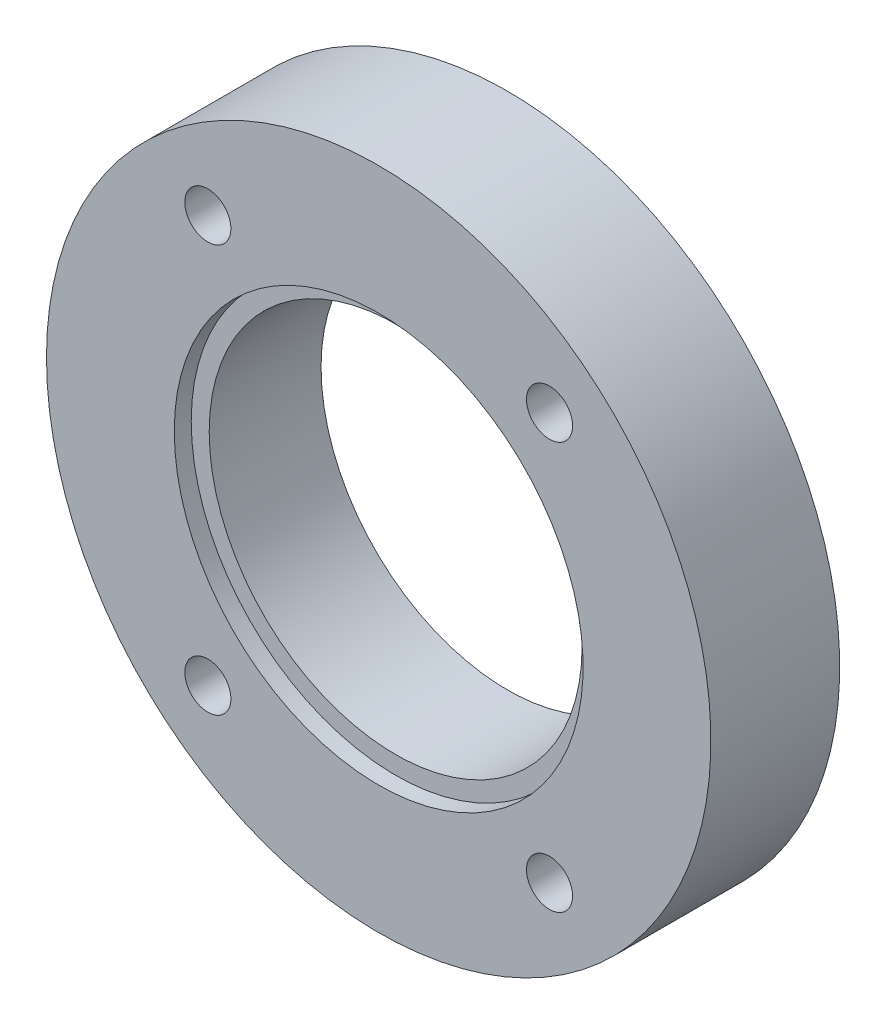
ISO-10303-21;
HEADER;
FILE_DESCRIPTION(('STEP AP214'),'2;1');
FILE_NAME('part.step','',(''),(''),'','','');
FILE_SCHEMA(('AUTOMOTIVE_DESIGN { 1 0 10303 214 1 1 1 1 }'));
ENDSEC;
DATA;
#1=APPLICATION_CONTEXT('core data for automotive mechanical design processes');
#2=APPLICATION_PROTOCOL_DEFINITION('international standard','automotive_design',2000,#1);
#3=PRODUCT_CONTEXT('',#1,'mechanical');
#4=PRODUCT('Part','Part','',(#3));
#5=PRODUCT_RELATED_PRODUCT_CATEGORY('part','',(#4));
#6=PRODUCT_DEFINITION_FORMATION('','',#4);
#7=PRODUCT_DEFINITION_CONTEXT('part definition',#1,'design');
#8=PRODUCT_DEFINITION('design','',#6,#7);
#9=PRODUCT_DEFINITION_SHAPE('','',#8);
#10=(LENGTH_UNIT() NAMED_UNIT(*) SI_UNIT(.MILLI.,.METRE.));
#11=(NAMED_UNIT(*) PLANE_ANGLE_UNIT() SI_UNIT($,.RADIAN.));
#12=(NAMED_UNIT(*) SI_UNIT($,.STERADIAN.) SOLID_ANGLE_UNIT());
#13=UNCERTAINTY_MEASURE_WITH_UNIT(LENGTH_MEASURE(1.E-05),#10,'distance_accuracy_value','');
#14=(GEOMETRIC_REPRESENTATION_CONTEXT(3) GLOBAL_UNCERTAINTY_ASSIGNED_CONTEXT((#13)) GLOBAL_UNIT_ASSIGNED_CONTEXT((#10,
#11,#12)) REPRESENTATION_CONTEXT('',''));
#15=CARTESIAN_POINT('',(0.,0.,0.));
#16=DIRECTION('',(0.,0.,1.));
#17=DIRECTION('',(1.,0.,0.));
#18=AXIS2_PLACEMENT_3D('',#15,#16,#17);
#19=CARTESIAN_POINT('',(0.,30.15,-2.5));
#20=DIRECTION('',(0.,0.,-1.));
#21=DIRECTION('',(0.,-1.,0.));
#22=AXIS2_PLACEMENT_3D('',#19,#20,#21);
#23=PLANE('',#22);
#24=CARTESIAN_POINT('',(0.,0.,-2.5));
#25=DIRECTION('',(0.,0.,-1.));
#26=DIRECTION('',(-1.,0.,0.));
#27=AXIS2_PLACEMENT_3D('',#24,#25,#26);
#28=CIRCLE('',#27,27.5);
#29=CARTESIAN_POINT('',(-27.5,0.,-2.5));
#30=VERTEX_POINT('',#29);
#31=EDGE_CURVE('E204',#30,#30,#28,.T.);
#32=ORIENTED_EDGE('',*,*,#31,.T.);
#33=EDGE_LOOP('',(#32));
#34=FACE_BOUND('',#33,.T.);
#35=CARTESIAN_POINT('',(0.,0.,-2.5));
#36=DIRECTION('',(0.,0.,1.));
#37=DIRECTION('',(1.,0.,0.));
#38=AXIS2_PLACEMENT_3D('',#35,#36,#37);
#39=CIRCLE('',#38,30.15);
#40=CARTESIAN_POINT('',(-30.15,0.,-2.5));
#41=VERTEX_POINT('',#40);
#42=EDGE_CURVE('E11',#41,#41,#39,.T.);
#43=ORIENTED_EDGE('',*,*,#42,.T.);
#44=EDGE_LOOP('',(#43));
#45=FACE_BOUND('',#44,.T.);
#46=ADVANCED_FACE('F48',(#34,#45),#23,.F.);
#47=CARTESIAN_POINT('',(0.,25.,-19.));
#48=DIRECTION('',(0.,0.,1.));
#49=DIRECTION('',(1.,0.,0.));
#50=AXIS2_PLACEMENT_3D('',#47,#48,#49);
#51=PLANE('',#50);
#52=CARTESIAN_POINT('',(0.,0.,-19.));
#53=DIRECTION('',(0.,0.,1.));
#54=DIRECTION('',(1.,0.,0.));
#55=AXIS2_PLACEMENT_3D('',#52,#53,#54);
#56=CIRCLE('',#55,27.5);
#57=CARTESIAN_POINT('',(27.5,0.,-19.));
#58=VERTEX_POINT('',#57);
#59=EDGE_CURVE('E52',#58,#58,#56,.T.);
#60=ORIENTED_EDGE('',*,*,#59,.T.);
#61=EDGE_LOOP('',(#60));
#62=FACE_BOUND('',#61,.T.);
#63=CARTESIAN_POINT('',(-25.1972743,30.02894217,-19.));
#64=DIRECTION('',(0.,0.,1.));
#65=DIRECTION('',(1.,0.,0.));
#66=AXIS2_PLACEMENT_3D('',#63,#64,#65);
#67=CIRCLE('',#66,3.4);
#68=CARTESIAN_POINT('',(-28.5972743,30.02894217,-19.));
#69=VERTEX_POINT('',#68);
#70=EDGE_CURVE('E95',#69,#69,#67,.T.);
#71=ORIENTED_EDGE('',*,*,#70,.T.);
#72=EDGE_LOOP('',(#71));
#73=FACE_BOUND('',#72,.T.);
#74=CARTESIAN_POINT('',(25.1972743,30.02894217,-19.));
#75=DIRECTION('',(0.,0.,1.));
#76=DIRECTION('',(1.,0.,0.));
#77=AXIS2_PLACEMENT_3D('',#74,#75,#76);
#78=CIRCLE('',#77,3.4);
#79=CARTESIAN_POINT('',(21.7972743,30.02894217,-19.));
#80=VERTEX_POINT('',#79);
#81=EDGE_CURVE('E148',#80,#80,#78,.T.);
#82=ORIENTED_EDGE('',*,*,#81,.T.);
#83=EDGE_LOOP('',(#82));
#84=FACE_BOUND('',#83,.T.);
#85=CARTESIAN_POINT('',(25.1972743,-30.02894217,-19.));
#86=DIRECTION('',(0.,0.,1.));
#87=DIRECTION('',(1.,0.,0.));
#88=AXIS2_PLACEMENT_3D('',#85,#86,#87);
#89=CIRCLE('',#88,3.4);
#90=CARTESIAN_POINT('',(21.7972743,-30.02894217,-19.));
#91=VERTEX_POINT('',#90);
#92=EDGE_CURVE('E163',#91,#91,#89,.T.);
#93=ORIENTED_EDGE('',*,*,#92,.T.);
#94=EDGE_LOOP('',(#93));
#95=FACE_BOUND('',#94,.T.);
#96=CARTESIAN_POINT('',(-25.1972743,-30.02894217,-19.));
#97=DIRECTION('',(0.,0.,1.));
#98=DIRECTION('',(1.,0.,0.));
#99=AXIS2_PLACEMENT_3D('',#96,#97,#98);
#100=CIRCLE('',#99,3.4);
#101=CARTESIAN_POINT('',(-28.5972743,-30.02894217,-19.));
#102=VERTEX_POINT('',#101);
#103=EDGE_CURVE('E130',#102,#102,#100,.T.);
#104=ORIENTED_EDGE('',*,*,#103,.T.);
#105=EDGE_LOOP('',(#104));
#106=FACE_BOUND('',#105,.T.);
#107=CARTESIAN_POINT('',(0.,0.,-19.));
#108=DIRECTION('',(0.,0.,1.));
#109=DIRECTION('',(1.,0.,0.));
#110=AXIS2_PLACEMENT_3D('',#107,#108,#109);
#111=CIRCLE('',#110,49.);
#112=CARTESIAN_POINT('',(-49.,0.,-19.));
#113=VERTEX_POINT('',#112);
#114=EDGE_CURVE('E158',#113,#113,#111,.T.);
#115=ORIENTED_EDGE('',*,*,#114,.F.);
#116=EDGE_LOOP('',(#115));
#117=FACE_BOUND('',#116,.T.);
#118=ADVANCED_FACE('F50',(#62,#73,#84,#95,#106,#117),#51,.F.);
#119=CARTESIAN_POINT('',(0.,30.15,0.));
#120=DIRECTION('',(0.,0.,-1.));
#121=DIRECTION('',(0.,-1.,0.));
#122=AXIS2_PLACEMENT_3D('',#119,#120,#121);
#123=PLANE('',#122);
#124=CARTESIAN_POINT('',(-25.1972743,-30.02894217,0.));
#125=DIRECTION('',(0.,0.,1.));
#126=DIRECTION('',(1.,0.,0.));
#127=AXIS2_PLACEMENT_3D('',#124,#125,#126);
#128=CIRCLE('',#127,3.4);
#129=CARTESIAN_POINT('',(-28.5972743,-30.02894217,0.));
#130=VERTEX_POINT('',#129);
#131=EDGE_CURVE('E145',#130,#130,#128,.T.);
#132=ORIENTED_EDGE('',*,*,#131,.F.);
#133=EDGE_LOOP('',(#132));
#134=FACE_BOUND('',#133,.T.);
#135=CARTESIAN_POINT('',(0.,0.,0.));
#136=DIRECTION('',(0.,0.,1.));
#137=DIRECTION('',(1.,0.,0.));
#138=AXIS2_PLACEMENT_3D('',#135,#136,#137);
#139=CIRCLE('',#138,30.15);
#140=CARTESIAN_POINT('',(-30.15,0.,0.));
#141=VERTEX_POINT('',#140);
#142=EDGE_CURVE('E174',#141,#141,#139,.T.);
#143=ORIENTED_EDGE('',*,*,#142,.F.);
#144=EDGE_LOOP('',(#143));
#145=FACE_BOUND('',#144,.T.);
#146=CARTESIAN_POINT('',(-25.1972743,30.02894217,0.));
#147=DIRECTION('',(0.,0.,1.));
#148=DIRECTION('',(1.,0.,0.));
#149=AXIS2_PLACEMENT_3D('',#146,#147,#148);
#150=CIRCLE('',#149,3.4);
#151=CARTESIAN_POINT('',(-28.5972743,30.02894217,0.));
#152=VERTEX_POINT('',#151);
#153=EDGE_CURVE('E167',#152,#152,#150,.T.);
#154=ORIENTED_EDGE('',*,*,#153,.F.);
#155=EDGE_LOOP('',(#154));
#156=FACE_BOUND('',#155,.T.);
#157=CARTESIAN_POINT('',(25.1972743,30.02894217,0.));
#158=DIRECTION('',(0.,0.,1.));
#159=DIRECTION('',(1.,0.,0.));
#160=AXIS2_PLACEMENT_3D('',#157,#158,#159);
#161=CIRCLE('',#160,3.4);
#162=CARTESIAN_POINT('',(21.7972743,30.02894217,0.));
#163=VERTEX_POINT('',#162);
#164=EDGE_CURVE('E155',#163,#163,#161,.T.);
#165=ORIENTED_EDGE('',*,*,#164,.F.);
#166=EDGE_LOOP('',(#165));
#167=FACE_BOUND('',#166,.T.);
#168=CARTESIAN_POINT('',(25.1972743,-30.02894217,0.));
#169=DIRECTION('',(0.,0.,1.));
#170=DIRECTION('',(1.,0.,0.));
#171=AXIS2_PLACEMENT_3D('',#168,#169,#170);
#172=CIRCLE('',#171,3.4);
#173=CARTESIAN_POINT('',(21.7972743,-30.02894217,0.));
#174=VERTEX_POINT('',#173);
#175=EDGE_CURVE('E135',#174,#174,#172,.T.);
#176=ORIENTED_EDGE('',*,*,#175,.F.);
#177=EDGE_LOOP('',(#176));
#178=FACE_BOUND('',#177,.T.);
#179=CARTESIAN_POINT('',(0.,0.,0.));
#180=DIRECTION('',(0.,0.,1.));
#181=DIRECTION('',(1.,0.,0.));
#182=AXIS2_PLACEMENT_3D('',#179,#180,#181);
#183=CIRCLE('',#182,49.);
#184=CARTESIAN_POINT('',(-49.,0.,0.));
#185=VERTEX_POINT('',#184);
#186=EDGE_CURVE('E159',#185,#185,#183,.T.);
#187=ORIENTED_EDGE('',*,*,#186,.T.);
#188=EDGE_LOOP('',(#187));
#189=FACE_BOUND('',#188,.T.);
#190=ADVANCED_FACE('F182',(#134,#145,#156,#167,#178,#189),#123,.F.);
#191=CARTESIAN_POINT('',(0.,0.,-1.25));
#192=DIRECTION('',(0.,0.,1.));
#193=DIRECTION('',(1.,0.,0.));
#194=AXIS2_PLACEMENT_3D('',#191,#192,#193);
#195=CYLINDRICAL_SURFACE('',#194,30.15);
#196=ORIENTED_EDGE('',*,*,#142,.T.);
#197=DIRECTION('',(0.,0.,-1.));
#198=VECTOR('',#197,1.);
#199=CARTESIAN_POINT('',(-30.15,0.,-1.25));
#200=LINE('',#199,#198);
#201=EDGE_CURVE('E58',#141,#41,#200,.T.);
#202=ORIENTED_EDGE('',*,*,#201,.T.);
#203=ORIENTED_EDGE('',*,*,#42,.F.);
#204=ORIENTED_EDGE('',*,*,#201,.F.);
#205=EDGE_LOOP('',(#196,#202,#203,#204));
#206=FACE_BOUND('',#205,.T.);
#207=ADVANCED_FACE('F179',(#206),#195,.F.);
#208=CARTESIAN_POINT('',(0.,0.,-9.5));
#209=DIRECTION('',(0.,0.,1.));
#210=DIRECTION('',(1.,0.,0.));
#211=AXIS2_PLACEMENT_3D('',#208,#209,#210);
#212=CYLINDRICAL_SURFACE('',#211,49.);
#213=ORIENTED_EDGE('',*,*,#186,.F.);
#214=DIRECTION('',(0.,0.,-1.));
#215=VECTOR('',#214,1.);
#216=CARTESIAN_POINT('',(-49.,0.,-9.5));
#217=LINE('',#216,#215);
#218=EDGE_CURVE('E87',#185,#113,#217,.T.);
#219=ORIENTED_EDGE('',*,*,#218,.T.);
#220=ORIENTED_EDGE('',*,*,#114,.T.);
#221=ORIENTED_EDGE('',*,*,#218,.F.);
#222=EDGE_LOOP('',(#213,#219,#220,#221));
#223=FACE_BOUND('',#222,.T.);
#224=ADVANCED_FACE('F192',(#223),#212,.T.);
#225=CARTESIAN_POINT('',(-25.1972743,30.02894217,-9.5));
#226=DIRECTION('',(0.,0.,1.));
#227=DIRECTION('',(1.,0.,0.));
#228=AXIS2_PLACEMENT_3D('',#225,#226,#227);
#229=CYLINDRICAL_SURFACE('',#228,3.4);
#230=ORIENTED_EDGE('',*,*,#153,.T.);
#231=DIRECTION('',(0.,0.,-1.));
#232=VECTOR('',#231,1.);
#233=CARTESIAN_POINT('',(-28.5972743,30.02894217,-9.5));
#234=LINE('',#233,#232);
#235=EDGE_CURVE('E103',#152,#69,#234,.T.);
#236=ORIENTED_EDGE('',*,*,#235,.T.);
#237=ORIENTED_EDGE('',*,*,#70,.F.);
#238=ORIENTED_EDGE('',*,*,#235,.F.);
#239=EDGE_LOOP('',(#230,#236,#237,#238));
#240=FACE_BOUND('',#239,.T.);
#241=ADVANCED_FACE('F230',(#240),#229,.F.);
#242=CARTESIAN_POINT('',(25.1972743,30.02894217,-9.5));
#243=DIRECTION('',(0.,0.,1.));
#244=DIRECTION('',(1.,0.,0.));
#245=AXIS2_PLACEMENT_3D('',#242,#243,#244);
#246=CYLINDRICAL_SURFACE('',#245,3.4);
#247=ORIENTED_EDGE('',*,*,#164,.T.);
#248=DIRECTION('',(0.,0.,-1.));
#249=VECTOR('',#248,1.);
#250=CARTESIAN_POINT('',(21.7972743,30.02894217,-9.5));
#251=LINE('',#250,#249);
#252=EDGE_CURVE('E151',#163,#80,#251,.T.);
#253=ORIENTED_EDGE('',*,*,#252,.T.);
#254=ORIENTED_EDGE('',*,*,#81,.F.);
#255=ORIENTED_EDGE('',*,*,#252,.F.);
#256=EDGE_LOOP('',(#247,#253,#254,#255));
#257=FACE_BOUND('',#256,.T.);
#258=ADVANCED_FACE('F237',(#257),#246,.F.);
#259=CARTESIAN_POINT('',(25.1972743,-30.02894217,-9.5));
#260=DIRECTION('',(0.,0.,1.));
#261=DIRECTION('',(1.,0.,0.));
#262=AXIS2_PLACEMENT_3D('',#259,#260,#261);
#263=CYLINDRICAL_SURFACE('',#262,3.4);
#264=ORIENTED_EDGE('',*,*,#175,.T.);
#265=DIRECTION('',(0.,0.,-1.));
#266=VECTOR('',#265,1.);
#267=CARTESIAN_POINT('',(21.7972743,-30.02894217,-9.5));
#268=LINE('',#267,#266);
#269=EDGE_CURVE('E142',#174,#91,#268,.T.);
#270=ORIENTED_EDGE('',*,*,#269,.T.);
#271=ORIENTED_EDGE('',*,*,#92,.F.);
#272=ORIENTED_EDGE('',*,*,#269,.F.);
#273=EDGE_LOOP('',(#264,#270,#271,#272));
#274=FACE_BOUND('',#273,.T.);
#275=ADVANCED_FACE('F221',(#274),#263,.F.);
#276=CARTESIAN_POINT('',(-25.1972743,-30.02894217,-9.5));
#277=DIRECTION('',(0.,0.,1.));
#278=DIRECTION('',(1.,0.,0.));
#279=AXIS2_PLACEMENT_3D('',#276,#277,#278);
#280=CYLINDRICAL_SURFACE('',#279,3.4);
#281=ORIENTED_EDGE('',*,*,#131,.T.);
#282=DIRECTION('',(0.,0.,-1.));
#283=VECTOR('',#282,1.);
#284=CARTESIAN_POINT('',(-28.5972743,-30.02894217,-9.5));
#285=LINE('',#284,#283);
#286=EDGE_CURVE('E136',#130,#102,#285,.T.);
#287=ORIENTED_EDGE('',*,*,#286,.T.);
#288=ORIENTED_EDGE('',*,*,#103,.F.);
#289=ORIENTED_EDGE('',*,*,#286,.F.);
#290=EDGE_LOOP('',(#281,#287,#288,#289));
#291=FACE_BOUND('',#290,.T.);
#292=ADVANCED_FACE('F215',(#291),#280,.F.);
#293=CARTESIAN_POINT('',(0.,0.,-24.));
#294=DIRECTION('',(0.,0.,1.));
#295=DIRECTION('',(1.,0.,0.));
#296=AXIS2_PLACEMENT_3D('',#293,#294,#295);
#297=CYLINDRICAL_SURFACE('',#296,27.5);
#298=ORIENTED_EDGE('',*,*,#59,.F.);
#299=EDGE_LOOP('',(#298));
#300=FACE_BOUND('',#299,.T.);
#301=ORIENTED_EDGE('',*,*,#31,.F.);
#302=EDGE_LOOP('',(#301));
#303=FACE_BOUND('',#302,.T.);
#304=ADVANCED_FACE('F212',(#300,#303),#297,.F.);
#305=CLOSED_SHELL('',(#46,#118,#190,#207,#224,#241,#258,#275,#292,#304));
#306=MANIFOLD_SOLID_BREP('B2',#305);
#307=ADVANCED_BREP_SHAPE_REPRESENTATION('',(#18,#306),#14);
#308=SHAPE_DEFINITION_REPRESENTATION(#9,#307);
ENDSEC;
END-ISO-10303-21;
